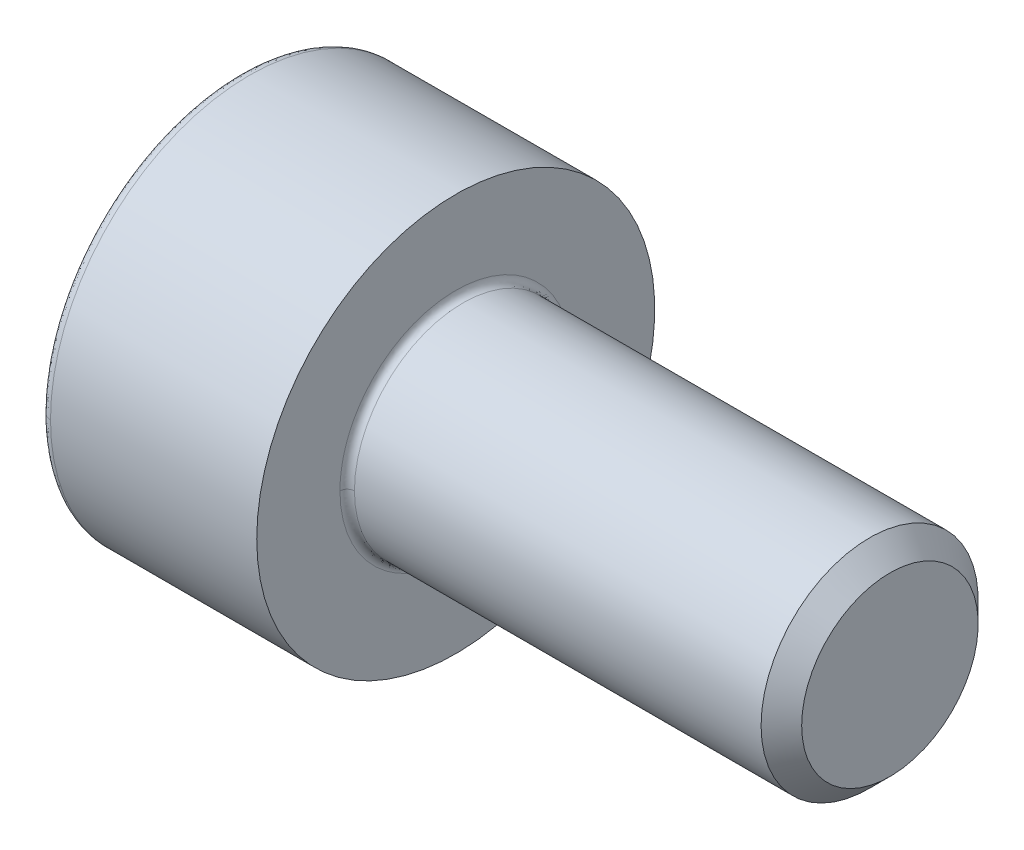
ISO-10303-21;
HEADER;
FILE_DESCRIPTION(('STEP AP214'),'2;1');
FILE_NAME('part.step','',(''),(''),'','','');
FILE_SCHEMA(('AUTOMOTIVE_DESIGN { 1 0 10303 214 1 1 1 1 }'));
ENDSEC;
DATA;
#1=APPLICATION_CONTEXT('core data for automotive mechanical design processes');
#2=APPLICATION_PROTOCOL_DEFINITION('international standard','automotive_design',2000,#1);
#3=PRODUCT_CONTEXT('',#1,'mechanical');
#4=PRODUCT('Part','Part','',(#3));
#5=PRODUCT_RELATED_PRODUCT_CATEGORY('part','',(#4));
#6=PRODUCT_DEFINITION_FORMATION('','',#4);
#7=PRODUCT_DEFINITION_CONTEXT('part definition',#1,'design');
#8=PRODUCT_DEFINITION('design','',#6,#7);
#9=PRODUCT_DEFINITION_SHAPE('','',#8);
#10=(LENGTH_UNIT() NAMED_UNIT(*) SI_UNIT(.MILLI.,.METRE.));
#11=(NAMED_UNIT(*) PLANE_ANGLE_UNIT() SI_UNIT($,.RADIAN.));
#12=(NAMED_UNIT(*) SI_UNIT($,.STERADIAN.) SOLID_ANGLE_UNIT());
#13=UNCERTAINTY_MEASURE_WITH_UNIT(LENGTH_MEASURE(1.E-05),#10,'distance_accuracy_value','');
#14=(GEOMETRIC_REPRESENTATION_CONTEXT(3) GLOBAL_UNCERTAINTY_ASSIGNED_CONTEXT((#13)) GLOBAL_UNIT_ASSIGNED_CONTEXT((#10,
#11,#12)) REPRESENTATION_CONTEXT('',''));
#15=CARTESIAN_POINT('',(0.,0.,0.));
#16=DIRECTION('',(0.,0.,1.));
#17=DIRECTION('',(1.,0.,0.));
#18=AXIS2_PLACEMENT_3D('',#15,#16,#17);
#19=CARTESIAN_POINT('',(9.,-1.234134,1.234134));
#20=DIRECTION('',(1.,0.,0.));
#21=DIRECTION('',(0.,0.,-1.));
#22=AXIS2_PLACEMENT_3D('',#19,#20,#21);
#23=PLANE('',#22);
#24=CARTESIAN_POINT('',(8.9999999999999,0.,0.));
#25=DIRECTION('',(-1.,0.,0.));
#26=DIRECTION('',(0.,0.,1.));
#27=AXIS2_PLACEMENT_3D('',#24,#25,#26);
#28=CIRCLE('',#27,1.2195000000001);
#29=CARTESIAN_POINT('',(8.9999999999999,0.,1.2195000000001));
#30=VERTEX_POINT('',#29);
#31=EDGE_CURVE('E20',#30,#30,#28,.F.);
#32=ORIENTED_EDGE('',*,*,#31,.T.);
#33=EDGE_LOOP('',(#32));
#34=FACE_BOUND('',#33,.T.);
#35=ADVANCED_FACE('F16',(#34),#23,.T.);
#36=CARTESIAN_POINT('',(9.,0.,0.));
#37=DIRECTION('',(-1.,0.,0.));
#38=DIRECTION('',(0.,0.,1.));
#39=AXIS2_PLACEMENT_3D('',#36,#37,#38);
#40=CONICAL_SURFACE('',#39,1.2195,0.785398163397446);
#41=CARTESIAN_POINT('',(8.7195,0.,0.));
#42=DIRECTION('',(-1.,0.,0.));
#43=DIRECTION('',(0.,0.,1.));
#44=AXIS2_PLACEMENT_3D('',#41,#42,#43);
#45=CIRCLE('',#44,1.5);
#46=CARTESIAN_POINT('',(8.7195,0.,1.5));
#47=VERTEX_POINT('',#46);
#48=EDGE_CURVE('E124',#47,#47,#45,.F.);
#49=ORIENTED_EDGE('',*,*,#48,.T.);
#50=EDGE_LOOP('',(#49));
#51=FACE_BOUND('',#50,.T.);
#52=ORIENTED_EDGE('',*,*,#31,.F.);
#53=EDGE_LOOP('',(#52));
#54=FACE_BOUND('',#53,.T.);
#55=ADVANCED_FACE('F277',(#51,#54),#40,.T.);
#56=CARTESIAN_POINT('',(8.7195,0.,0.));
#57=DIRECTION('',(-1.,0.,0.));
#58=DIRECTION('',(0.,0.,1.));
#59=AXIS2_PLACEMENT_3D('',#56,#57,#58);
#60=CYLINDRICAL_SURFACE('',#59,1.5);
#61=CARTESIAN_POINT('',(3.10000000018145,0.,0.));
#62=DIRECTION('',(1.,0.,0.));
#63=DIRECTION('',(0.,0.,-1.));
#64=AXIS2_PLACEMENT_3D('',#61,#62,#63);
#65=CIRCLE('',#64,1.49999999962574);
#66=CARTESIAN_POINT('',(3.10000000018145,-1.53827571386498E-10,-1.4999999997193));
#67=VERTEX_POINT('',#66);
#68=CARTESIAN_POINT('',(3.10000000013609,0.,1.4999999997193));
#69=VERTEX_POINT('',#68);
#70=EDGE_CURVE('E128',#67,#69,#65,.T.);
#71=ORIENTED_EDGE('',*,*,#70,.T.);
#72=CARTESIAN_POINT('',(3.10000000018145,0.,0.));
#73=DIRECTION('',(1.,0.,0.));
#74=DIRECTION('',(0.,0.,-1.));
#75=AXIS2_PLACEMENT_3D('',#72,#73,#74);
#76=CIRCLE('',#75,1.49999999962574);
#77=EDGE_CURVE('E114',#69,#67,#76,.T.);
#78=ORIENTED_EDGE('',*,*,#77,.T.);
#79=EDGE_LOOP('',(#71,#78));
#80=FACE_BOUND('',#79,.T.);
#81=ORIENTED_EDGE('',*,*,#48,.F.);
#82=EDGE_LOOP('',(#81));
#83=FACE_BOUND('',#82,.T.);
#84=ADVANCED_FACE('F134',(#80,#83),#60,.T.);
#85=CARTESIAN_POINT('',(3.000499583,0.,1.609983342));
#86=CARTESIAN_POINT('',(3.000499583,-3.219966683,1.609983342));
#87=CARTESIAN_POINT('',(3.000499583,-3.219966683,-1.609983342));
#88=CARTESIAN_POINT('',(3.000499583,0.,-1.609983342));
#89=CARTESIAN_POINT('',(2.993677958,0.,1.541994623));
#90=CARTESIAN_POINT('',(2.993677958,-3.083989247,1.541994623));
#91=CARTESIAN_POINT('',(2.993677958,-3.083989247,-1.541994623));
#92=CARTESIAN_POINT('',(2.993677958,0.,-1.541994623));
#93=CARTESIAN_POINT('',(3.041994623,0.,1.493677958));
#94=CARTESIAN_POINT('',(3.041994623,-2.987355915,1.493677958));
#95=CARTESIAN_POINT('',(3.041994623,-2.987355915,-1.493677958));
#96=CARTESIAN_POINT('',(3.041994623,0.,-1.493677958));
#97=CARTESIAN_POINT('',(3.109983342,0.,1.500499583));
#98=CARTESIAN_POINT('',(3.109983342,-3.000999167,1.500499583));
#99=CARTESIAN_POINT('',(3.109983342,-3.000999167,-1.500499583));
#100=CARTESIAN_POINT('',(3.109983342,0.,-1.500499583));
#101=(BOUNDED_SURFACE() B_SPLINE_SURFACE(3,3,((#85,#86,#87,#88),(#89,#90,#91,#92),(#93,#94,#95,
#96),(#97,#98,#99,#100)),.UNSPECIFIED.,.F.,.F.,.F.) B_SPLINE_SURFACE_WITH_KNOTS((4,4),(4,4),(0.,
1.),(0.,1.),.UNSPECIFIED.) GEOMETRIC_REPRESENTATION_ITEM() RATIONAL_B_SPLINE_SURFACE(((1.,
0.333333333333333,0.333333333333333,1.),(0.755320871117972,0.251773623705991,0.251773623705991,
0.755320871117972),(0.755320871117972,0.251773623705991,0.251773623705991,0.755320871117972),
(1.,0.333333333333333,0.333333333333333,1.))) REPRESENTATION_ITEM('') SURFACE());
#102=CARTESIAN_POINT('',(3.000499583,0.,1.609983342));
#103=CARTESIAN_POINT('',(2.993677958,0.,1.541994623));
#104=CARTESIAN_POINT('',(3.041994623,0.,1.493677958));
#105=CARTESIAN_POINT('',(3.109983342,0.,1.500499583));
#106=(BOUNDED_CURVE() B_SPLINE_CURVE(3,(#102,#103,#104,#105),.UNSPECIFIED.,.F.,
.F.) B_SPLINE_CURVE_WITH_KNOTS((4,4),(0.,1.),
.UNSPECIFIED.) CURVE() GEOMETRIC_REPRESENTATION_ITEM() RATIONAL_B_SPLINE_CURVE((1.,
0.755320871117972,0.755320871117972,1.)) REPRESENTATION_ITEM(''));
#107=CARTESIAN_POINT('',(2.99999999977544,0.,1.60000000018946));
#108=VERTEX_POINT('',#107);
#109=EDGE_CURVE('E118',#69,#108,#106,.F.);
#110=CARTESIAN_POINT('',(2.99999999962574,0.,1.60000000036693));
#111=CARTESIAN_POINT('',(2.99999999962574,-3.19999999999695,1.60000000036693));
#112=CARTESIAN_POINT('',(2.99999999962574,-3.19999999999695,-1.60000000036693));
#113=CARTESIAN_POINT('',(2.99999999962574,0.,-1.60000000036693));
#114=(BOUNDED_CURVE() B_SPLINE_CURVE(3,(#110,#111,#112,#113),.UNSPECIFIED.,.F.,
.F.) B_SPLINE_CURVE_WITH_KNOTS((4,4),(0.,1.),
.UNSPECIFIED.) CURVE() GEOMETRIC_REPRESENTATION_ITEM() RATIONAL_B_SPLINE_CURVE((0.956578302900928,
0.318859434300309,0.318859434300309,0.956578302900928)) REPRESENTATION_ITEM(''));
#115=CARTESIAN_POINT('',(2.99999999977544,0.,-1.60000000018946));
#116=VERTEX_POINT('',#115);
#117=EDGE_CURVE('E132',#116,#108,#114,.F.);
#118=CARTESIAN_POINT('',(3.000499583,0.,-1.609983342));
#119=CARTESIAN_POINT('',(2.993677958,0.,-1.541994623));
#120=CARTESIAN_POINT('',(3.041994623,0.,-1.493677958));
#121=CARTESIAN_POINT('',(3.109983342,0.,-1.500499583));
#122=(BOUNDED_CURVE() B_SPLINE_CURVE(3,(#118,#119,#120,#121),.UNSPECIFIED.,.F.,
.F.) B_SPLINE_CURVE_WITH_KNOTS((4,4),(0.,1.),
.UNSPECIFIED.) CURVE() GEOMETRIC_REPRESENTATION_ITEM() RATIONAL_B_SPLINE_CURVE((1.,
0.755320871117972,0.755320871117972,1.)) REPRESENTATION_ITEM(''));
#123=EDGE_CURVE('E120',#116,#67,#122,.T.);
#124=ORIENTED_EDGE('',*,*,#109,.T.);
#125=ORIENTED_EDGE('',*,*,#117,.F.);
#126=ORIENTED_EDGE('',*,*,#123,.T.);
#127=ORIENTED_EDGE('',*,*,#77,.F.);
#128=EDGE_LOOP('',(#124,#125,#126,#127));
#129=FACE_BOUND('',#128,.T.);
#130=ADVANCED_FACE('F116',(#129),#101,.F.);
#131=CARTESIAN_POINT('',(3.000499583,0.,-1.609983342));
#132=CARTESIAN_POINT('',(3.000499583,3.219966683,-1.609983342));
#133=CARTESIAN_POINT('',(3.000499583,3.219966683,1.609983342));
#134=CARTESIAN_POINT('',(3.000499583,0.,1.609983342));
#135=CARTESIAN_POINT('',(2.993677958,0.,-1.541994623));
#136=CARTESIAN_POINT('',(2.993677958,3.083989247,-1.541994623));
#137=CARTESIAN_POINT('',(2.993677958,3.083989247,1.541994623));
#138=CARTESIAN_POINT('',(2.993677958,0.,1.541994623));
#139=CARTESIAN_POINT('',(3.041994623,0.,-1.493677958));
#140=CARTESIAN_POINT('',(3.041994623,2.987355915,-1.493677958));
#141=CARTESIAN_POINT('',(3.041994623,2.987355915,1.493677958));
#142=CARTESIAN_POINT('',(3.041994623,0.,1.493677958));
#143=CARTESIAN_POINT('',(3.109983342,0.,-1.500499583));
#144=CARTESIAN_POINT('',(3.109983342,3.000999167,-1.500499583));
#145=CARTESIAN_POINT('',(3.109983342,3.000999167,1.500499583));
#146=CARTESIAN_POINT('',(3.109983342,0.,1.500499583));
#147=(BOUNDED_SURFACE() B_SPLINE_SURFACE(3,3,((#131,#132,#133,#134),(#135,#136,#137,#138),(#139,
#140,#141,#142),(#143,#144,#145,#146)),.UNSPECIFIED.,.F.,.F.,
.F.) B_SPLINE_SURFACE_WITH_KNOTS((4,4),(4,4),(0.,1.),(0.,1.),
.UNSPECIFIED.) GEOMETRIC_REPRESENTATION_ITEM() RATIONAL_B_SPLINE_SURFACE(((1.,0.333333333333333,
0.333333333333333,1.),(0.755320871117972,0.251773623705991,0.251773623705991,0.755320871117972),
(0.755320871117972,0.251773623705991,0.251773623705991,0.755320871117972),(1.,0.333333333333333,
0.333333333333333,1.))) REPRESENTATION_ITEM('') SURFACE());
#148=CARTESIAN_POINT('',(2.99999999962574,0.,-1.60000000036693));
#149=CARTESIAN_POINT('',(2.99999999962574,3.19999999999695,-1.60000000036693));
#150=CARTESIAN_POINT('',(2.99999999962574,3.19999999999695,1.60000000036693));
#151=CARTESIAN_POINT('',(2.99999999962574,0.,1.60000000036693));
#152=(BOUNDED_CURVE() B_SPLINE_CURVE(3,(#148,#149,#150,#151),.UNSPECIFIED.,.F.,
.F.) B_SPLINE_CURVE_WITH_KNOTS((4,4),(0.,1.),
.UNSPECIFIED.) CURVE() GEOMETRIC_REPRESENTATION_ITEM() RATIONAL_B_SPLINE_CURVE((0.956578302900929,
0.318859434300309,0.318859434300309,0.956578302900929)) REPRESENTATION_ITEM(''));
#153=EDGE_CURVE('E130',#108,#116,#152,.F.);
#154=ORIENTED_EDGE('',*,*,#70,.F.);
#155=ORIENTED_EDGE('',*,*,#123,.F.);
#156=ORIENTED_EDGE('',*,*,#153,.F.);
#157=ORIENTED_EDGE('',*,*,#109,.F.);
#158=EDGE_LOOP('',(#154,#155,#156,#157));
#159=FACE_BOUND('',#158,.T.);
#160=ADVANCED_FACE('F127',(#159),#147,.F.);
#161=CARTESIAN_POINT('',(3.,-2.783,2.783));
#162=DIRECTION('',(1.,0.,0.));
#163=DIRECTION('',(0.,0.,-1.));
#164=AXIS2_PLACEMENT_3D('',#161,#162,#163);
#165=PLANE('',#164);
#166=ORIENTED_EDGE('',*,*,#117,.T.);
#167=ORIENTED_EDGE('',*,*,#153,.T.);
#168=EDGE_LOOP('',(#166,#167));
#169=FACE_BOUND('',#168,.T.);
#170=CARTESIAN_POINT('',(3.,0.,0.));
#171=DIRECTION('',(-1.,0.,0.));
#172=DIRECTION('',(0.,0.,1.));
#173=AXIS2_PLACEMENT_3D('',#170,#171,#172);
#174=CIRCLE('',#173,2.75);
#175=CARTESIAN_POINT('',(3.,0.,2.75));
#176=VERTEX_POINT('',#175);
#177=EDGE_CURVE('E240',#176,#176,#174,.F.);
#178=ORIENTED_EDGE('',*,*,#177,.T.);
#179=EDGE_LOOP('',(#178));
#180=FACE_BOUND('',#179,.T.);
#181=ADVANCED_FACE('F152',(#169,#180),#165,.T.);
#182=CARTESIAN_POINT('',(3.,0.,0.));
#183=DIRECTION('',(-1.,0.,0.));
#184=DIRECTION('',(0.,0.,1.));
#185=AXIS2_PLACEMENT_3D('',#182,#183,#184);
#186=CYLINDRICAL_SURFACE('',#185,2.75);
#187=ORIENTED_EDGE('',*,*,#177,.F.);
#188=EDGE_LOOP('',(#187));
#189=FACE_BOUND('',#188,.T.);
#190=CARTESIAN_POINT('',(0.149999999478334,0.,0.));
#191=DIRECTION('',(-1.,0.,0.));
#192=DIRECTION('',(0.,-1.,0.));
#193=AXIS2_PLACEMENT_3D('',#190,#191,#192);
#194=CIRCLE('',#193,2.75000000012743);
#195=CARTESIAN_POINT('',(0.14999999960875,-1.23466239089508E-10,2.75000000009557));
#196=VERTEX_POINT('',#195);
#197=CARTESIAN_POINT('',(0.149999999478334,-2.8201721420858E-10,-2.75000000009557));
#198=VERTEX_POINT('',#197);
#199=EDGE_CURVE('E242',#196,#198,#194,.T.);
#200=ORIENTED_EDGE('',*,*,#199,.F.);
#201=CARTESIAN_POINT('',(0.149999999478334,0.,0.));
#202=DIRECTION('',(-1.,0.,0.));
#203=DIRECTION('',(0.,-1.,0.));
#204=AXIS2_PLACEMENT_3D('',#201,#202,#203);
#205=CIRCLE('',#204,2.75000000012743);
#206=EDGE_CURVE('E328',#198,#196,#205,.T.);
#207=ORIENTED_EDGE('',*,*,#206,.F.);
#208=EDGE_LOOP('',(#200,#207));
#209=FACE_BOUND('',#208,.T.);
#210=ADVANCED_FACE('F162',(#189,#209),#186,.T.);
#211=CARTESIAN_POINT('',(0.000749375,0.,2.585024988));
#212=CARTESIAN_POINT('',(0.000749375,5.170049975,2.585024988));
#213=CARTESIAN_POINT('',(0.000749375,5.170049975,-2.585024988));
#214=CARTESIAN_POINT('',(0.000749375,0.,-2.585024988));
#215=CARTESIAN_POINT('',(-0.009483063,0.,2.687008065));
#216=CARTESIAN_POINT('',(-0.009483063,5.37401613,2.687008065));
#217=CARTESIAN_POINT('',(-0.009483063,5.37401613,-2.687008065));
#218=CARTESIAN_POINT('',(-0.009483063,0.,-2.687008065));
#219=CARTESIAN_POINT('',(0.062991935,0.,2.759483063));
#220=CARTESIAN_POINT('',(0.062991935,5.518966127,2.759483063));
#221=CARTESIAN_POINT('',(0.062991935,5.518966127,-2.759483063));
#222=CARTESIAN_POINT('',(0.062991935,0.,-2.759483063));
#223=CARTESIAN_POINT('',(0.164975012,0.,2.749250625));
#224=CARTESIAN_POINT('',(0.164975012,5.49850125,2.749250625));
#225=CARTESIAN_POINT('',(0.164975012,5.49850125,-2.749250625));
#226=CARTESIAN_POINT('',(0.164975012,0.,-2.749250625));
#227=(BOUNDED_SURFACE() B_SPLINE_SURFACE(3,3,((#211,#212,#213,#214),(#215,#216,#217,#218),(#219,
#220,#221,#222),(#223,#224,#225,#226)),.UNSPECIFIED.,.F.,.F.,
.F.) B_SPLINE_SURFACE_WITH_KNOTS((4,4),(4,4),(0.,1.),(0.,1.),
.UNSPECIFIED.) GEOMETRIC_REPRESENTATION_ITEM() RATIONAL_B_SPLINE_SURFACE(((1.,0.333333333333333,
0.333333333333333,1.),(0.755320871117972,0.251773623705991,0.251773623705991,0.755320871117972),
(0.755320871117972,0.251773623705991,0.251773623705991,0.755320871117972),(1.,0.333333333333333,
0.333333333333333,1.))) REPRESENTATION_ITEM('') SURFACE());
#228=CARTESIAN_POINT('',(-1.27425771590546E-10,0.,-2.60000000073584));
#229=CARTESIAN_POINT('',(-1.27425772797033E-10,5.20000000062092,-2.60000000073584));
#230=CARTESIAN_POINT('',(-1.27425772797033E-10,5.20000000062092,2.60000000073584));
#231=CARTESIAN_POINT('',(-1.27425771590546E-10,0.,2.60000000073584));
#232=(BOUNDED_CURVE() B_SPLINE_CURVE(3,(#228,#229,#230,#231),.UNSPECIFIED.,.F.,
.F.) B_SPLINE_CURVE_WITH_KNOTS((4,4),(0.,1.),
.UNSPECIFIED.) CURVE() GEOMETRIC_REPRESENTATION_ITEM() RATIONAL_B_SPLINE_CURVE((0.956578301600254,
0.318859433866751,0.318859433866751,0.956578301600254)) REPRESENTATION_ITEM(''));
#233=CARTESIAN_POINT('',(-7.64554631740211E-11,0.,2.59999999988283));
#234=VERTEX_POINT('',#233);
#235=CARTESIAN_POINT('',(-7.64554631740211E-11,0.,-2.59999999988283));
#236=VERTEX_POINT('',#235);
#237=EDGE_CURVE('E88',#234,#236,#232,.F.);
#238=CARTESIAN_POINT('',(0.000749375,0.,2.585024988));
#239=CARTESIAN_POINT('',(-0.009483063,0.,2.687008065));
#240=CARTESIAN_POINT('',(0.062991935,0.,2.759483063));
#241=CARTESIAN_POINT('',(0.164975012,0.,2.749250625));
#242=(BOUNDED_CURVE() B_SPLINE_CURVE(3,(#238,#239,#240,#241),.UNSPECIFIED.,.F.,
.F.) B_SPLINE_CURVE_WITH_KNOTS((4,4),(0.,1.),
.UNSPECIFIED.) CURVE() GEOMETRIC_REPRESENTATION_ITEM() RATIONAL_B_SPLINE_CURVE((1.,
0.755320871117972,0.755320871117972,1.)) REPRESENTATION_ITEM(''));
#243=EDGE_CURVE('E321',#196,#234,#242,.F.);
#244=CARTESIAN_POINT('',(0.000749375,0.,-2.585024988));
#245=CARTESIAN_POINT('',(-0.009483063,0.,-2.687008065));
#246=CARTESIAN_POINT('',(0.062991935,0.,-2.759483063));
#247=CARTESIAN_POINT('',(0.164975012,0.,-2.749250625));
#248=(BOUNDED_CURVE() B_SPLINE_CURVE(3,(#244,#245,#246,#247),.UNSPECIFIED.,.F.,
.F.) B_SPLINE_CURVE_WITH_KNOTS((4,4),(0.,1.),
.UNSPECIFIED.) CURVE() GEOMETRIC_REPRESENTATION_ITEM() RATIONAL_B_SPLINE_CURVE((1.,
0.755320871117972,0.755320871117972,1.)) REPRESENTATION_ITEM(''));
#249=EDGE_CURVE('E245',#236,#198,#248,.T.);
#250=ORIENTED_EDGE('',*,*,#237,.F.);
#251=ORIENTED_EDGE('',*,*,#243,.F.);
#252=ORIENTED_EDGE('',*,*,#199,.T.);
#253=ORIENTED_EDGE('',*,*,#249,.F.);
#254=EDGE_LOOP('',(#250,#251,#252,#253));
#255=FACE_BOUND('',#254,.T.);
#256=ADVANCED_FACE('F304',(#255),#227,.T.);
#257=CARTESIAN_POINT('',(0.000749375,0.,-2.585024988));
#258=CARTESIAN_POINT('',(0.000749375,-5.170049975,-2.585024988));
#259=CARTESIAN_POINT('',(0.000749375,-5.170049975,2.585024988));
#260=CARTESIAN_POINT('',(0.000749375,0.,2.585024988));
#261=CARTESIAN_POINT('',(-0.009483063,0.,-2.687008065));
#262=CARTESIAN_POINT('',(-0.009483063,-5.37401613,-2.687008065));
#263=CARTESIAN_POINT('',(-0.009483063,-5.37401613,2.687008065));
#264=CARTESIAN_POINT('',(-0.009483063,0.,2.687008065));
#265=CARTESIAN_POINT('',(0.062991935,0.,-2.759483063));
#266=CARTESIAN_POINT('',(0.062991935,-5.518966127,-2.759483063));
#267=CARTESIAN_POINT('',(0.062991935,-5.518966127,2.759483063));
#268=CARTESIAN_POINT('',(0.062991935,0.,2.759483063));
#269=CARTESIAN_POINT('',(0.164975012,0.,-2.749250625));
#270=CARTESIAN_POINT('',(0.164975012,-5.49850125,-2.749250625));
#271=CARTESIAN_POINT('',(0.164975012,-5.49850125,2.749250625));
#272=CARTESIAN_POINT('',(0.164975012,0.,2.749250625));
#273=(BOUNDED_SURFACE() B_SPLINE_SURFACE(3,3,((#257,#258,#259,#260),(#261,#262,#263,#264),(#265,
#266,#267,#268),(#269,#270,#271,#272)),.UNSPECIFIED.,.F.,.F.,
.F.) B_SPLINE_SURFACE_WITH_KNOTS((4,4),(4,4),(0.,1.),(0.,1.),
.UNSPECIFIED.) GEOMETRIC_REPRESENTATION_ITEM() RATIONAL_B_SPLINE_SURFACE(((1.,0.333333333333333,
0.333333333333333,1.),(0.755320871117972,0.251773623705991,0.251773623705991,0.755320871117972),
(0.755320871117972,0.251773623705991,0.251773623705991,0.755320871117972),(1.,0.333333333333333,
0.333333333333333,1.))) REPRESENTATION_ITEM('') SURFACE());
#274=CARTESIAN_POINT('',(-1.27425771556979E-10,0.,2.60000000073584));
#275=CARTESIAN_POINT('',(-1.27425772893086E-10,-5.20000000062091,2.60000000073584));
#276=CARTESIAN_POINT('',(-1.27425772893086E-10,-5.20000000062091,-2.60000000073584));
#277=CARTESIAN_POINT('',(-1.27425771556979E-10,0.,-2.60000000073584));
#278=(BOUNDED_CURVE() B_SPLINE_CURVE(3,(#274,#275,#276,#277),.UNSPECIFIED.,.F.,
.F.) B_SPLINE_CURVE_WITH_KNOTS((4,4),(0.,1.),
.UNSPECIFIED.) CURVE() GEOMETRIC_REPRESENTATION_ITEM() RATIONAL_B_SPLINE_CURVE((0.956578301600254,
0.318859433866751,0.318859433866751,0.956578301600254)) REPRESENTATION_ITEM(''));
#279=EDGE_CURVE('E239',#236,#234,#278,.F.);
#280=ORIENTED_EDGE('',*,*,#243,.T.);
#281=ORIENTED_EDGE('',*,*,#279,.F.);
#282=ORIENTED_EDGE('',*,*,#249,.T.);
#283=ORIENTED_EDGE('',*,*,#206,.T.);
#284=EDGE_LOOP('',(#280,#281,#282,#283));
#285=FACE_BOUND('',#284,.T.);
#286=ADVANCED_FACE('F298',(#285),#273,.T.);
#287=CARTESIAN_POINT('',(0.,0.739008345,-1.28));
#288=DIRECTION('',(0.,0.866025403949298,-0.499999999714455));
#289=DIRECTION('',(0.,0.499999999714455,0.866025403949298));
#290=AXIS2_PLACEMENT_3D('',#287,#288,#289);
#291=PLANE('',#290);
#292=DIRECTION('',(1.,0.,0.));
#293=VECTOR('',#292,1.);
#294=CARTESIAN_POINT('',(0.65,0.739008345,-1.28));
#295=LINE('',#294,#293);
#296=CARTESIAN_POINT('',(0.,0.739008345947006,-1.28));
#297=VERTEX_POINT('',#296);
#298=CARTESIAN_POINT('',(1.3,0.739008345,-1.28));
#299=VERTEX_POINT('',#298);
#300=EDGE_CURVE('E517',#297,#299,#295,.T.);
#301=ORIENTED_EDGE('',*,*,#300,.T.);
#302=DIRECTION('',(0.,0.499999999714455,0.866025403949298));
#303=VECTOR('',#302,1.);
#304=CARTESIAN_POINT('',(1.3,0.739008345,-1.28));
#305=LINE('',#304,#303);
#306=CARTESIAN_POINT('',(1.3,1.108512517132,-0.639999999636343));
#307=VERTEX_POINT('',#306);
#308=EDGE_CURVE('E224',#299,#307,#305,.T.);
#309=ORIENTED_EDGE('',*,*,#308,.T.);
#310=DIRECTION('',(0.,0.499999999714455,0.866025403949298));
#311=VECTOR('',#310,1.);
#312=CARTESIAN_POINT('',(1.3,0.739008345,-1.28));
#313=LINE('',#312,#311);
#314=CARTESIAN_POINT('',(1.3,1.478016689,0.));
#315=VERTEX_POINT('',#314);
#316=EDGE_CURVE('E231',#307,#315,#313,.T.);
#317=ORIENTED_EDGE('',*,*,#316,.T.);
#318=DIRECTION('',(1.,0.,0.));
#319=VECTOR('',#318,1.);
#320=CARTESIAN_POINT('',(0.65,1.478016689,0.));
#321=LINE('',#320,#319);
#322=CARTESIAN_POINT('',(0.,1.478016688021,-1.54152404730953E-10));
#323=VERTEX_POINT('',#322);
#324=EDGE_CURVE('E80',#323,#315,#321,.T.);
#325=ORIENTED_EDGE('',*,*,#324,.F.);
#326=DIRECTION('',(0.,0.499999998030773,0.866025404921373));
#327=VECTOR('',#326,1.);
#328=CARTESIAN_POINT('',(0.,0.7390083464192,-1.2800000008224));
#329=LINE('',#328,#327);
#330=EDGE_CURVE('E235',#297,#323,#329,.T.);
#331=ORIENTED_EDGE('',*,*,#330,.F.);
#332=EDGE_LOOP('',(#301,#309,#317,#325,#331));
#333=FACE_BOUND('',#332,.T.);
#334=ADVANCED_FACE('F164',(#333),#291,.F.);
#335=CARTESIAN_POINT('',(0.,0.739008345,1.28));
#336=DIRECTION('',(0.,-0.866025403949298,-0.499999999714455));
#337=DIRECTION('',(0.,0.499999999714455,-0.866025403949298));
#338=AXIS2_PLACEMENT_3D('',#335,#336,#337);
#339=PLANE('',#338);
#340=DIRECTION('',(0.,0.499999999714455,-0.866025403949298));
#341=VECTOR('',#340,1.);
#342=CARTESIAN_POINT('',(1.3,0.739008345,1.28));
#343=LINE('',#342,#341);
#344=CARTESIAN_POINT('',(1.3,1.10851251699887,0.64000000000195));
#345=VERTEX_POINT('',#344);
#346=CARTESIAN_POINT('',(1.3,0.739008345,1.28));
#347=VERTEX_POINT('',#346);
#348=EDGE_CURVE('E233',#345,#347,#343,.F.);
#349=ORIENTED_EDGE('',*,*,#348,.T.);
#350=DIRECTION('',(-1.,0.,0.));
#351=VECTOR('',#350,1.);
#352=CARTESIAN_POINT('',(0.65,0.739008345,1.28));
#353=LINE('',#352,#351);
#354=CARTESIAN_POINT('',(0.,0.739008345947007,1.28));
#355=VERTEX_POINT('',#354);
#356=EDGE_CURVE('E554',#347,#355,#353,.T.);
#357=ORIENTED_EDGE('',*,*,#356,.T.);
#358=DIRECTION('',(0.,-0.499999998030772,0.866025404921373));
#359=VECTOR('',#358,1.);
#360=CARTESIAN_POINT('',(0.,1.478016687576,0.));
#361=LINE('',#360,#359);
#362=EDGE_CURVE('E237',#323,#355,#361,.T.);
#363=ORIENTED_EDGE('',*,*,#362,.F.);
#364=ORIENTED_EDGE('',*,*,#324,.T.);
#365=DIRECTION('',(0.,0.499999999714455,-0.866025403949298));
#366=VECTOR('',#365,1.);
#367=CARTESIAN_POINT('',(1.3,0.739008345,1.28));
#368=LINE('',#367,#366);
#369=EDGE_CURVE('E228',#315,#345,#368,.F.);
#370=ORIENTED_EDGE('',*,*,#369,.T.);
#371=EDGE_LOOP('',(#349,#357,#363,#364,#370));
#372=FACE_BOUND('',#371,.T.);
#373=ADVANCED_FACE('F190',(#372),#339,.T.);
#374=CARTESIAN_POINT('',(0.,-2.6312,-2.6312));
#375=DIRECTION('',(-1.,0.,0.));
#376=DIRECTION('',(0.,0.,1.));
#377=AXIS2_PLACEMENT_3D('',#374,#375,#376);
#378=PLANE('',#377);
#379=DIRECTION('',(0.,1.,0.));
#380=VECTOR('',#379,1.);
#381=CARTESIAN_POINT('',(0.,0.,-1.28));
#382=LINE('',#381,#380);
#383=CARTESIAN_POINT('',(0.,-0.739008345157689,-1.28));
#384=VERTEX_POINT('',#383);
#385=EDGE_CURVE('E555',#384,#297,#382,.T.);
#386=ORIENTED_EDGE('',*,*,#385,.T.);
#387=ORIENTED_EDGE('',*,*,#330,.T.);
#388=ORIENTED_EDGE('',*,*,#362,.T.);
#389=DIRECTION('',(0.,-1.,0.));
#390=VECTOR('',#389,1.);
#391=CARTESIAN_POINT('',(0.,0.,1.28));
#392=LINE('',#391,#390);
#393=CARTESIAN_POINT('',(0.,-0.739008345,1.28));
#394=VERTEX_POINT('',#393);
#395=EDGE_CURVE('E566',#355,#394,#392,.T.);
#396=ORIENTED_EDGE('',*,*,#395,.T.);
#397=DIRECTION('',(0.,0.499999999714455,0.866025403949298));
#398=VECTOR('',#397,1.);
#399=CARTESIAN_POINT('',(0.,-1.108512517,0.64));
#400=LINE('',#399,#398);
#401=CARTESIAN_POINT('',(0.,-1.478016689,0.));
#402=VERTEX_POINT('',#401);
#403=EDGE_CURVE('E550',#402,#394,#400,.T.);
#404=ORIENTED_EDGE('',*,*,#403,.F.);
#405=DIRECTION('',(0.,-0.499999999714455,0.866025403949298));
#406=VECTOR('',#405,1.);
#407=CARTESIAN_POINT('',(0.,-1.108512517,-0.64));
#408=LINE('',#407,#406);
#409=EDGE_CURVE('E227',#384,#402,#408,.T.);
#410=ORIENTED_EDGE('',*,*,#409,.F.);
#411=EDGE_LOOP('',(#386,#387,#388,#396,#404,#410));
#412=FACE_BOUND('',#411,.T.);
#413=ORIENTED_EDGE('',*,*,#237,.T.);
#414=ORIENTED_EDGE('',*,*,#279,.T.);
#415=EDGE_LOOP('',(#413,#414));
#416=FACE_BOUND('',#415,.T.);
#417=ADVANCED_FACE('F180',(#412,#416),#378,.T.);
#418=CARTESIAN_POINT('',(1.3,-0.006651075,1.28));
#419=DIRECTION('',(1.,0.,0.));
#420=DIRECTION('',(0.,0.,-1.));
#421=AXIS2_PLACEMENT_3D('',#418,#419,#420);
#422=PLANE('',#421);
#423=ORIENTED_EDGE('',*,*,#348,.F.);
#424=CARTESIAN_POINT('',(1.3,0.,0.));
#425=DIRECTION('',(-1.,0.,0.));
#426=DIRECTION('',(0.,0.,1.));
#427=AXIS2_PLACEMENT_3D('',#424,#425,#426);
#428=CIRCLE('',#427,1.28);
#429=CARTESIAN_POINT('',(1.3,-1.14935844388778E-10,1.28));
#430=VERTEX_POINT('',#429);
#431=EDGE_CURVE('E220',#430,#345,#428,.T.);
#432=ORIENTED_EDGE('',*,*,#431,.F.);
#433=DIRECTION('',(0.,1.,0.));
#434=VECTOR('',#433,1.);
#435=CARTESIAN_POINT('',(1.3,0.,1.28));
#436=LINE('',#435,#434);
#437=EDGE_CURVE('E553',#430,#347,#436,.T.);
#438=ORIENTED_EDGE('',*,*,#437,.T.);
#439=EDGE_LOOP('',(#423,#432,#438));
#440=FACE_BOUND('',#439,.T.);
#441=ADVANCED_FACE('F189',(#440),#422,.F.);
#442=CARTESIAN_POINT('',(1.3,1.106295492,0.64768));
#443=DIRECTION('',(1.,0.,0.));
#444=DIRECTION('',(0.,0.,-1.));
#445=AXIS2_PLACEMENT_3D('',#442,#443,#444);
#446=PLANE('',#445);
#447=ORIENTED_EDGE('',*,*,#316,.F.);
#448=CARTESIAN_POINT('',(1.3,0.,0.));
#449=DIRECTION('',(-1.,0.,0.));
#450=DIRECTION('',(0.,0.,1.));
#451=AXIS2_PLACEMENT_3D('',#448,#449,#450);
#452=CIRCLE('',#451,1.28);
#453=EDGE_CURVE('E217',#345,#307,#452,.T.);
#454=ORIENTED_EDGE('',*,*,#453,.F.);
#455=ORIENTED_EDGE('',*,*,#369,.F.);
#456=EDGE_LOOP('',(#447,#454,#455));
#457=FACE_BOUND('',#456,.T.);
#458=ADVANCED_FACE('F441',(#457),#446,.F.);
#459=CARTESIAN_POINT('',(1.3,-0.006651075,-0.63616));
#460=DIRECTION('',(1.,0.,0.));
#461=DIRECTION('',(0.,0.,-1.));
#462=AXIS2_PLACEMENT_3D('',#459,#460,#461);
#463=PLANE('',#462);
#464=DIRECTION('',(0.,-1.,0.));
#465=VECTOR('',#464,1.);
#466=CARTESIAN_POINT('',(1.3,0.,-1.28));
#467=LINE('',#466,#465);
#468=CARTESIAN_POINT('',(1.3,-2.62532394416325E-10,-1.28));
#469=VERTEX_POINT('',#468);
#470=EDGE_CURVE('E542',#299,#469,#467,.T.);
#471=ORIENTED_EDGE('',*,*,#470,.T.);
#472=CARTESIAN_POINT('',(1.3,0.,0.));
#473=DIRECTION('',(-1.,0.,0.));
#474=DIRECTION('',(0.,0.,1.));
#475=AXIS2_PLACEMENT_3D('',#472,#473,#474);
#476=CIRCLE('',#475,1.28);
#477=EDGE_CURVE('E215',#307,#469,#476,.T.);
#478=ORIENTED_EDGE('',*,*,#477,.F.);
#479=ORIENTED_EDGE('',*,*,#308,.F.);
#480=EDGE_LOOP('',(#471,#478,#479));
#481=FACE_BOUND('',#480,.T.);
#482=ADVANCED_FACE('F448',(#481),#463,.F.);
#483=CARTESIAN_POINT('',(0.,-0.739008345,-1.28));
#484=DIRECTION('',(0.,0.866025403949298,0.499999999714455));
#485=DIRECTION('',(0.,-0.499999999714455,0.866025403949298));
#486=AXIS2_PLACEMENT_3D('',#483,#484,#485);
#487=PLANE('',#486);
#488=DIRECTION('',(0.,-0.499999999714455,0.866025403949298));
#489=VECTOR('',#488,1.);
#490=CARTESIAN_POINT('',(1.3,-0.739008345,-1.28));
#491=LINE('',#490,#489);
#492=CARTESIAN_POINT('',(1.3,-1.10851251708602,-0.639999999851008));
#493=VERTEX_POINT('',#492);
#494=CARTESIAN_POINT('',(1.3,-0.739008345,-1.28));
#495=VERTEX_POINT('',#494);
#496=EDGE_CURVE('E212',#493,#495,#491,.F.);
#497=ORIENTED_EDGE('',*,*,#496,.T.);
#498=DIRECTION('',(-1.,0.,0.));
#499=VECTOR('',#498,1.);
#500=CARTESIAN_POINT('',(0.65,-0.739008345,-1.28));
#501=LINE('',#500,#499);
#502=EDGE_CURVE('E543',#495,#384,#501,.T.);
#503=ORIENTED_EDGE('',*,*,#502,.T.);
#504=ORIENTED_EDGE('',*,*,#409,.T.);
#505=DIRECTION('',(-1.,0.,0.));
#506=VECTOR('',#505,1.);
#507=CARTESIAN_POINT('',(0.65,-1.478016689,0.));
#508=LINE('',#507,#506);
#509=CARTESIAN_POINT('',(1.3,-1.478016689,0.));
#510=VERTEX_POINT('',#509);
#511=EDGE_CURVE('E223',#510,#402,#508,.T.);
#512=ORIENTED_EDGE('',*,*,#511,.F.);
#513=DIRECTION('',(0.,0.499999999714455,-0.866025403949298));
#514=VECTOR('',#513,1.);
#515=CARTESIAN_POINT('',(1.3,-1.108512517,-0.64));
#516=LINE('',#515,#514);
#517=EDGE_CURVE('E515',#510,#493,#516,.T.);
#518=ORIENTED_EDGE('',*,*,#517,.T.);
#519=EDGE_LOOP('',(#497,#503,#504,#512,#518));
#520=FACE_BOUND('',#519,.T.);
#521=ADVANCED_FACE('F455',(#520),#487,.T.);
#522=CARTESIAN_POINT('',(0.,-0.739008345,-1.28));
#523=DIRECTION('',(0.,0.,-1.));
#524=DIRECTION('',(0.,1.,0.));
#525=AXIS2_PLACEMENT_3D('',#522,#523,#524);
#526=PLANE('',#525);
#527=ORIENTED_EDGE('',*,*,#502,.F.);
#528=DIRECTION('',(0.,1.,0.));
#529=VECTOR('',#528,1.);
#530=CARTESIAN_POINT('',(1.3,-0.5542562585,-1.28));
#531=LINE('',#530,#529);
#532=EDGE_CURVE('E211',#495,#469,#531,.T.);
#533=ORIENTED_EDGE('',*,*,#532,.T.);
#534=ORIENTED_EDGE('',*,*,#470,.F.);
#535=ORIENTED_EDGE('',*,*,#300,.F.);
#536=ORIENTED_EDGE('',*,*,#385,.F.);
#537=EDGE_LOOP('',(#527,#533,#534,#535,#536));
#538=FACE_BOUND('',#537,.T.);
#539=ADVANCED_FACE('F463',(#538),#526,.F.);
#540=CARTESIAN_POINT('',(0.,0.739008345,1.28));
#541=DIRECTION('',(0.,0.,1.));
#542=DIRECTION('',(0.,-1.,0.));
#543=AXIS2_PLACEMENT_3D('',#540,#541,#542);
#544=PLANE('',#543);
#545=ORIENTED_EDGE('',*,*,#356,.F.);
#546=ORIENTED_EDGE('',*,*,#437,.F.);
#547=DIRECTION('',(0.,-1.,0.));
#548=VECTOR('',#547,1.);
#549=CARTESIAN_POINT('',(1.3,-0.5542562585,1.28));
#550=LINE('',#549,#548);
#551=CARTESIAN_POINT('',(1.3,-0.739008345,1.28));
#552=VERTEX_POINT('',#551);
#553=EDGE_CURVE('E209',#430,#552,#550,.T.);
#554=ORIENTED_EDGE('',*,*,#553,.T.);
#555=DIRECTION('',(1.,0.,0.));
#556=VECTOR('',#555,1.);
#557=CARTESIAN_POINT('',(0.65,-0.739008345,1.28));
#558=LINE('',#557,#556);
#559=EDGE_CURVE('E525',#394,#552,#558,.T.);
#560=ORIENTED_EDGE('',*,*,#559,.F.);
#561=ORIENTED_EDGE('',*,*,#395,.F.);
#562=EDGE_LOOP('',(#545,#546,#554,#560,#561));
#563=FACE_BOUND('',#562,.T.);
#564=ADVANCED_FACE('F471',(#563),#544,.F.);
#565=CARTESIAN_POINT('',(0.,-1.478016689,0.));
#566=DIRECTION('',(0.,0.866025403949298,-0.499999999714455));
#567=DIRECTION('',(0.,0.499999999714455,0.866025403949298));
#568=AXIS2_PLACEMENT_3D('',#565,#566,#567);
#569=PLANE('',#568);
#570=DIRECTION('',(0.,0.499999999714455,0.866025403949298));
#571=VECTOR('',#570,1.);
#572=CARTESIAN_POINT('',(1.3,-1.478016689,0.));
#573=LINE('',#572,#571);
#574=CARTESIAN_POINT('',(1.3,-1.10851251700262,0.639999999860437));
#575=VERTEX_POINT('',#574);
#576=EDGE_CURVE('E35',#575,#510,#573,.F.);
#577=ORIENTED_EDGE('',*,*,#576,.T.);
#578=ORIENTED_EDGE('',*,*,#511,.T.);
#579=ORIENTED_EDGE('',*,*,#403,.T.);
#580=ORIENTED_EDGE('',*,*,#559,.T.);
#581=DIRECTION('',(0.,0.499999999714455,0.866025403949298));
#582=VECTOR('',#581,1.);
#583=CARTESIAN_POINT('',(1.3,-1.478016689,0.));
#584=LINE('',#583,#582);
#585=EDGE_CURVE('E206',#552,#575,#584,.F.);
#586=ORIENTED_EDGE('',*,*,#585,.T.);
#587=EDGE_LOOP('',(#577,#578,#579,#580,#586));
#588=FACE_BOUND('',#587,.T.);
#589=ADVANCED_FACE('F479',(#588),#569,.T.);
#590=CARTESIAN_POINT('',(1.3,-1.115163592,-0.63616));
#591=DIRECTION('',(1.,0.,0.));
#592=DIRECTION('',(0.,0.,-1.));
#593=AXIS2_PLACEMENT_3D('',#590,#591,#592);
#594=PLANE('',#593);
#595=ORIENTED_EDGE('',*,*,#496,.F.);
#596=CARTESIAN_POINT('',(1.3,0.,0.));
#597=DIRECTION('',(-1.,0.,0.));
#598=DIRECTION('',(0.,0.,1.));
#599=AXIS2_PLACEMENT_3D('',#596,#597,#598);
#600=CIRCLE('',#599,1.28);
#601=EDGE_CURVE('E203',#469,#493,#600,.T.);
#602=ORIENTED_EDGE('',*,*,#601,.F.);
#603=ORIENTED_EDGE('',*,*,#532,.F.);
#604=EDGE_LOOP('',(#595,#602,#603));
#605=FACE_BOUND('',#604,.T.);
#606=ADVANCED_FACE('F487',(#605),#594,.F.);
#607=CARTESIAN_POINT('',(1.3,-1.480233714,0.64768));
#608=DIRECTION('',(1.,0.,0.));
#609=DIRECTION('',(0.,0.,-1.));
#610=AXIS2_PLACEMENT_3D('',#607,#608,#609);
#611=PLANE('',#610);
#612=ORIENTED_EDGE('',*,*,#576,.F.);
#613=CARTESIAN_POINT('',(1.3,0.,0.));
#614=DIRECTION('',(-1.,0.,0.));
#615=DIRECTION('',(0.,0.,1.));
#616=AXIS2_PLACEMENT_3D('',#613,#614,#615);
#617=CIRCLE('',#616,1.28);
#618=EDGE_CURVE('E26',#493,#575,#617,.T.);
#619=ORIENTED_EDGE('',*,*,#618,.F.);
#620=ORIENTED_EDGE('',*,*,#517,.F.);
#621=EDGE_LOOP('',(#612,#619,#620));
#622=FACE_BOUND('',#621,.T.);
#623=ADVANCED_FACE('F293',(#622),#611,.F.);
#624=CARTESIAN_POINT('',(1.3,-1.115163592,1.28));
#625=DIRECTION('',(1.,0.,0.));
#626=DIRECTION('',(0.,0.,-1.));
#627=AXIS2_PLACEMENT_3D('',#624,#625,#626);
#628=PLANE('',#627);
#629=ORIENTED_EDGE('',*,*,#553,.F.);
#630=CARTESIAN_POINT('',(1.3,0.,0.));
#631=DIRECTION('',(-1.,0.,0.));
#632=DIRECTION('',(0.,0.,1.));
#633=AXIS2_PLACEMENT_3D('',#630,#631,#632);
#634=CIRCLE('',#633,1.28);
#635=EDGE_CURVE('E11',#575,#430,#634,.T.);
#636=ORIENTED_EDGE('',*,*,#635,.F.);
#637=ORIENTED_EDGE('',*,*,#585,.F.);
#638=EDGE_LOOP('',(#629,#636,#637));
#639=FACE_BOUND('',#638,.T.);
#640=ADVANCED_FACE('F18',(#639),#628,.F.);
#641=CARTESIAN_POINT('',(2.039008345,0.,0.));
#642=DIRECTION('',(-1.,0.,0.));
#643=DIRECTION('',(0.,0.,1.));
#644=AXIS2_PLACEMENT_3D('',#641,#642,#643);
#645=CONICAL_SURFACE('',#644,0.,1.04719755094038);
#646=CARTESIAN_POINT('',(2.039008345,0.,0.));
#647=VERTEX_POINT('',#646);
#648=VERTEX_LOOP('',#647);
#649=FACE_BOUND('',#648,.T.);
#650=ORIENTED_EDGE('',*,*,#618,.T.);
#651=ORIENTED_EDGE('',*,*,#635,.T.);
#652=ORIENTED_EDGE('',*,*,#431,.T.);
#653=ORIENTED_EDGE('',*,*,#453,.T.);
#654=ORIENTED_EDGE('',*,*,#477,.T.);
#655=ORIENTED_EDGE('',*,*,#601,.T.);
#656=EDGE_LOOP('',(#650,#651,#652,#653,#654,#655));
#657=FACE_BOUND('',#656,.T.);
#658=ADVANCED_FACE('F286',(#649,#657),#645,.F.);
#659=CLOSED_SHELL('',(#35,#55,#84,#130,#160,#181,#210,#256,#286,#334,#373,#417,#441,#458,#482,
#521,#539,#564,#589,#606,#623,#640,#658));
#660=MANIFOLD_SOLID_BREP('B1',#659);
#661=ADVANCED_BREP_SHAPE_REPRESENTATION('',(#18,#660),#14);
#662=SHAPE_DEFINITION_REPRESENTATION(#9,#661);
ENDSEC;
END-ISO-10303-21;
